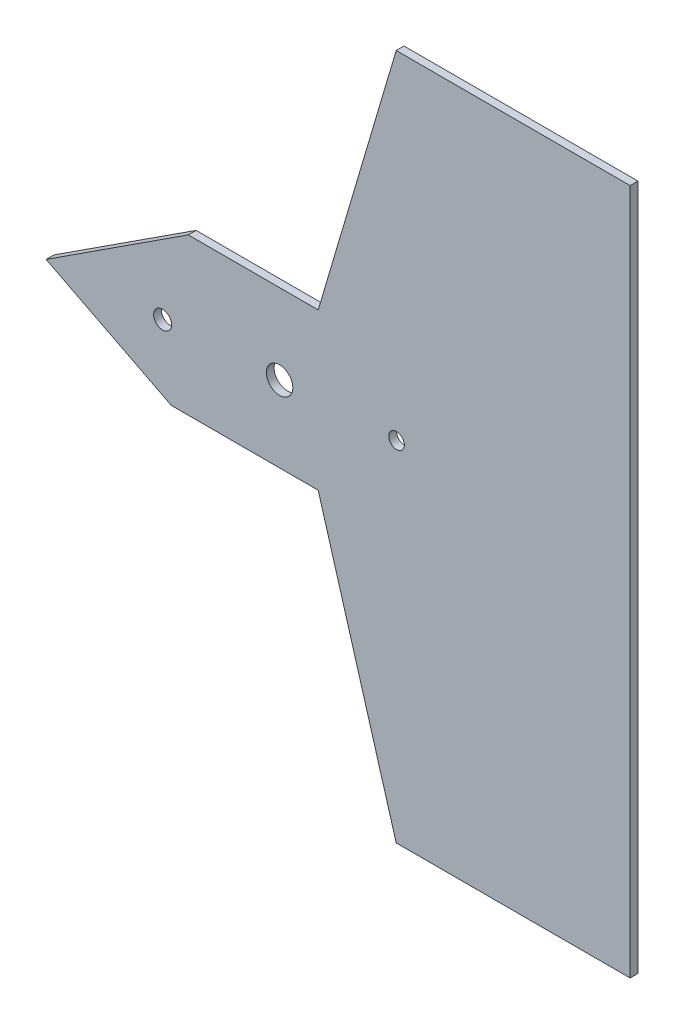
ISO-10303-21;
HEADER;
FILE_DESCRIPTION(('STEP AP214'),'2;1');
FILE_NAME('part.step','',(''),(''),'','','');
FILE_SCHEMA(('AUTOMOTIVE_DESIGN { 1 0 10303 214 1 1 1 1 }'));
ENDSEC;
DATA;
#1=APPLICATION_CONTEXT('core data for automotive mechanical design processes');
#2=APPLICATION_PROTOCOL_DEFINITION('international standard','automotive_design',2000,#1);
#3=PRODUCT_CONTEXT('',#1,'mechanical');
#4=PRODUCT('Part','Part','',(#3));
#5=PRODUCT_RELATED_PRODUCT_CATEGORY('part','',(#4));
#6=PRODUCT_DEFINITION_FORMATION('','',#4);
#7=PRODUCT_DEFINITION_CONTEXT('part definition',#1,'design');
#8=PRODUCT_DEFINITION('design','',#6,#7);
#9=PRODUCT_DEFINITION_SHAPE('','',#8);
#10=(LENGTH_UNIT() NAMED_UNIT(*) SI_UNIT(.MILLI.,.METRE.));
#11=(NAMED_UNIT(*) PLANE_ANGLE_UNIT() SI_UNIT($,.RADIAN.));
#12=(NAMED_UNIT(*) SI_UNIT($,.STERADIAN.) SOLID_ANGLE_UNIT());
#13=UNCERTAINTY_MEASURE_WITH_UNIT(LENGTH_MEASURE(1.E-05),#10,'distance_accuracy_value','');
#14=(GEOMETRIC_REPRESENTATION_CONTEXT(3) GLOBAL_UNCERTAINTY_ASSIGNED_CONTEXT((#13)) GLOBAL_UNIT_ASSIGNED_CONTEXT((#10,
#11,#12)) REPRESENTATION_CONTEXT('',''));
#15=CARTESIAN_POINT('',(0.,0.,0.));
#16=DIRECTION('',(0.,0.,1.));
#17=DIRECTION('',(1.,0.,0.));
#18=AXIS2_PLACEMENT_3D('',#15,#16,#17);
#19=CARTESIAN_POINT('',(141.039124357338,-8.97202755054697,311.2));
#20=DIRECTION('',(0.453981370177938,0.891011175873436,0.));
#21=DIRECTION('',(-0.891011175873436,0.453981370177938,0.));
#22=AXIS2_PLACEMENT_3D('',#19,#20,#21);
#23=PLANE('',#22);
#24=DIRECTION('',(0.891011175873435,-0.453981370177938,0.));
#25=VECTOR('',#24,1.);
#26=CARTESIAN_POINT('',(141.039124357338,-8.97202755054697,310.2));
#27=LINE('',#26,#25);
#28=CARTESIAN_POINT('',(124.975757597737,-0.787540701607435,310.2));
#29=VERTEX_POINT('',#28);
#30=CARTESIAN_POINT('',(141.039124357338,-8.97202755054697,310.2));
#31=VERTEX_POINT('',#30);
#32=EDGE_CURVE('E136',#29,#31,#27,.T.);
#33=ORIENTED_EDGE('',*,*,#32,.T.);
#34=DIRECTION('',(0.,0.,-1.));
#35=VECTOR('',#34,1.);
#36=CARTESIAN_POINT('',(141.039124357338,-8.97202755054697,311.2));
#37=LINE('',#36,#35);
#38=CARTESIAN_POINT('',(141.039124357338,-8.97202755054697,311.2));
#39=VERTEX_POINT('',#38);
#40=EDGE_CURVE('E11',#39,#31,#37,.T.);
#41=ORIENTED_EDGE('',*,*,#40,.F.);
#42=DIRECTION('',(0.891011175873435,-0.453981370177938,0.));
#43=VECTOR('',#42,1.);
#44=CARTESIAN_POINT('',(141.039124357338,-8.97202755054697,311.2));
#45=LINE('',#44,#43);
#46=CARTESIAN_POINT('',(124.975757597737,-0.787540701607435,311.2));
#47=VERTEX_POINT('',#46);
#48=EDGE_CURVE('E153',#47,#39,#45,.T.);
#49=ORIENTED_EDGE('',*,*,#48,.F.);
#50=DIRECTION('',(0.,0.,-1.));
#51=VECTOR('',#50,1.);
#52=CARTESIAN_POINT('',(124.975757597737,-0.787540701607435,311.2));
#53=LINE('',#52,#51);
#54=EDGE_CURVE('E132',#47,#29,#53,.T.);
#55=ORIENTED_EDGE('',*,*,#54,.T.);
#56=EDGE_LOOP('',(#33,#41,#49,#55));
#57=FACE_BOUND('',#56,.T.);
#58=ADVANCED_FACE('F34',(#57),#23,.F.);
#59=CARTESIAN_POINT('',(159.872932481578,-8.97202755054697,311.2));
#60=DIRECTION('',(0.,1.,0.));
#61=DIRECTION('',(-1.,0.,0.));
#62=AXIS2_PLACEMENT_3D('',#59,#60,#61);
#63=PLANE('',#62);
#64=DIRECTION('',(1.,0.,0.));
#65=VECTOR('',#64,1.);
#66=CARTESIAN_POINT('',(159.872932481578,-8.97202755054697,310.2));
#67=LINE('',#66,#65);
#68=CARTESIAN_POINT('',(159.872932481578,-8.97202755054697,310.2));
#69=VERTEX_POINT('',#68);
#70=EDGE_CURVE('E139',#31,#69,#67,.T.);
#71=ORIENTED_EDGE('',*,*,#70,.T.);
#72=DIRECTION('',(0.,0.,-1.));
#73=VECTOR('',#72,1.);
#74=CARTESIAN_POINT('',(159.872932481578,-8.97202755054697,311.2));
#75=LINE('',#74,#73);
#76=CARTESIAN_POINT('',(159.872932481578,-8.97202755054697,311.2));
#77=VERTEX_POINT('',#76);
#78=EDGE_CURVE('E42',#77,#69,#75,.T.);
#79=ORIENTED_EDGE('',*,*,#78,.F.);
#80=DIRECTION('',(1.,0.,0.));
#81=VECTOR('',#80,1.);
#82=CARTESIAN_POINT('',(159.872932481578,-8.97202755054697,311.2));
#83=LINE('',#82,#81);
#84=EDGE_CURVE('E96',#39,#77,#83,.T.);
#85=ORIENTED_EDGE('',*,*,#84,.F.);
#86=ORIENTED_EDGE('',*,*,#40,.T.);
#87=EDGE_LOOP('',(#71,#79,#85,#86));
#88=FACE_BOUND('',#87,.T.);
#89=ADVANCED_FACE('F239',(#88),#63,.F.);
#90=CARTESIAN_POINT('',(169.872932481578,-43.1379794844354,311.2));
#91=DIRECTION('',(0.959735822824036,0.280904165843568,0.));
#92=DIRECTION('',(-0.280904165843568,0.959735822824036,0.));
#93=AXIS2_PLACEMENT_3D('',#90,#91,#92);
#94=PLANE('',#93);
#95=DIRECTION('',(0.280904165843568,-0.959735822824036,0.));
#96=VECTOR('',#95,1.);
#97=CARTESIAN_POINT('',(169.872932481578,-43.1379794844354,310.2));
#98=LINE('',#97,#96);
#99=CARTESIAN_POINT('',(169.872932481578,-43.1379794844354,310.2));
#100=VERTEX_POINT('',#99);
#101=EDGE_CURVE('E142',#69,#100,#98,.T.);
#102=ORIENTED_EDGE('',*,*,#101,.T.);
#103=DIRECTION('',(0.,0.,-1.));
#104=VECTOR('',#103,1.);
#105=CARTESIAN_POINT('',(169.872932481578,-43.1379794844354,311.2));
#106=LINE('',#105,#104);
#107=CARTESIAN_POINT('',(169.872932481578,-43.1379794844354,311.2));
#108=VERTEX_POINT('',#107);
#109=EDGE_CURVE('E163',#108,#100,#106,.T.);
#110=ORIENTED_EDGE('',*,*,#109,.F.);
#111=DIRECTION('',(0.280904165843568,-0.959735822824036,0.));
#112=VECTOR('',#111,1.);
#113=CARTESIAN_POINT('',(169.872932481578,-43.1379794844354,311.2));
#114=LINE('',#113,#112);
#115=EDGE_CURVE('E171',#77,#108,#114,.T.);
#116=ORIENTED_EDGE('',*,*,#115,.F.);
#117=ORIENTED_EDGE('',*,*,#78,.T.);
#118=EDGE_LOOP('',(#102,#110,#116,#117));
#119=FACE_BOUND('',#118,.T.);
#120=ADVANCED_FACE('F169',(#119),#94,.F.);
#121=CARTESIAN_POINT('',(199.872932481578,-43.1379794844354,311.2));
#122=DIRECTION('',(0.,1.,0.));
#123=DIRECTION('',(-1.,0.,0.));
#124=AXIS2_PLACEMENT_3D('',#121,#122,#123);
#125=PLANE('',#124);
#126=DIRECTION('',(1.,0.,0.));
#127=VECTOR('',#126,1.);
#128=CARTESIAN_POINT('',(199.872932481578,-43.1379794844354,310.2));
#129=LINE('',#128,#127);
#130=CARTESIAN_POINT('',(199.872932481578,-43.1379794844354,310.2));
#131=VERTEX_POINT('',#130);
#132=EDGE_CURVE('E144',#100,#131,#129,.T.);
#133=ORIENTED_EDGE('',*,*,#132,.T.);
#134=DIRECTION('',(0.,0.,-1.));
#135=VECTOR('',#134,1.);
#136=CARTESIAN_POINT('',(199.872932481578,-43.1379794844354,311.2));
#137=LINE('',#136,#135);
#138=CARTESIAN_POINT('',(199.872932481578,-43.1379794844354,311.2));
#139=VERTEX_POINT('',#138);
#140=EDGE_CURVE('E160',#139,#131,#137,.T.);
#141=ORIENTED_EDGE('',*,*,#140,.F.);
#142=DIRECTION('',(1.,0.,0.));
#143=VECTOR('',#142,1.);
#144=CARTESIAN_POINT('',(199.872932481578,-43.1379794844354,311.2));
#145=LINE('',#144,#143);
#146=EDGE_CURVE('E187',#108,#139,#145,.T.);
#147=ORIENTED_EDGE('',*,*,#146,.F.);
#148=ORIENTED_EDGE('',*,*,#109,.T.);
#149=EDGE_LOOP('',(#133,#141,#147,#148));
#150=FACE_BOUND('',#149,.T.);
#151=ADVANCED_FACE('F180',(#150),#125,.F.);
#152=CARTESIAN_POINT('',(199.872932481578,44.8620205155646,311.2));
#153=DIRECTION('',(-1.,0.,0.));
#154=DIRECTION('',(0.,0.,1.));
#155=AXIS2_PLACEMENT_3D('',#152,#153,#154);
#156=PLANE('',#155);
#157=DIRECTION('',(0.,1.,0.));
#158=VECTOR('',#157,1.);
#159=CARTESIAN_POINT('',(199.872932481578,44.8620205155646,310.2));
#160=LINE('',#159,#158);
#161=CARTESIAN_POINT('',(199.872932481578,44.8620205155646,310.2));
#162=VERTEX_POINT('',#161);
#163=EDGE_CURVE('E146',#131,#162,#160,.T.);
#164=ORIENTED_EDGE('',*,*,#163,.T.);
#165=DIRECTION('',(0.,0.,-1.));
#166=VECTOR('',#165,1.);
#167=CARTESIAN_POINT('',(199.872932481578,44.8620205155646,311.2));
#168=LINE('',#167,#166);
#169=CARTESIAN_POINT('',(199.872932481578,44.8620205155646,311.2));
#170=VERTEX_POINT('',#169);
#171=EDGE_CURVE('E157',#170,#162,#168,.T.);
#172=ORIENTED_EDGE('',*,*,#171,.F.);
#173=DIRECTION('',(0.,1.,0.));
#174=VECTOR('',#173,1.);
#175=CARTESIAN_POINT('',(199.872932481578,44.8620205155646,311.2));
#176=LINE('',#175,#174);
#177=EDGE_CURVE('E186',#139,#170,#176,.T.);
#178=ORIENTED_EDGE('',*,*,#177,.F.);
#179=ORIENTED_EDGE('',*,*,#140,.T.);
#180=EDGE_LOOP('',(#164,#172,#178,#179));
#181=FACE_BOUND('',#180,.T.);
#182=ADVANCED_FACE('F184',(#181),#156,.F.);
#183=CARTESIAN_POINT('',(169.872932481578,44.8620205155646,311.2));
#184=DIRECTION('',(0.,-1.,0.));
#185=DIRECTION('',(0.,0.,-1.));
#186=AXIS2_PLACEMENT_3D('',#183,#184,#185);
#187=PLANE('',#186);
#188=DIRECTION('',(-1.,0.,0.));
#189=VECTOR('',#188,1.);
#190=CARTESIAN_POINT('',(169.872932481578,44.8620205155646,310.2));
#191=LINE('',#190,#189);
#192=CARTESIAN_POINT('',(169.872932481578,44.8620205155646,310.2));
#193=VERTEX_POINT('',#192);
#194=EDGE_CURVE('E148',#162,#193,#191,.T.);
#195=ORIENTED_EDGE('',*,*,#194,.T.);
#196=DIRECTION('',(0.,0.,-1.));
#197=VECTOR('',#196,1.);
#198=CARTESIAN_POINT('',(169.872932481578,44.8620205155646,311.2));
#199=LINE('',#198,#197);
#200=CARTESIAN_POINT('',(169.872932481578,44.8620205155646,311.2));
#201=VERTEX_POINT('',#200);
#202=EDGE_CURVE('E127',#201,#193,#199,.T.);
#203=ORIENTED_EDGE('',*,*,#202,.F.);
#204=DIRECTION('',(-1.,0.,0.));
#205=VECTOR('',#204,1.);
#206=CARTESIAN_POINT('',(169.872932481578,44.8620205155646,311.2));
#207=LINE('',#206,#205);
#208=EDGE_CURVE('E118',#170,#201,#207,.T.);
#209=ORIENTED_EDGE('',*,*,#208,.F.);
#210=ORIENTED_EDGE('',*,*,#171,.T.);
#211=EDGE_LOOP('',(#195,#203,#209,#210));
#212=FACE_BOUND('',#211,.T.);
#213=ADVANCED_FACE('F247',(#212),#187,.F.);
#214=CARTESIAN_POINT('',(159.872932481578,11.0554301249445,311.2));
#215=DIRECTION('',(0.958927561970118,-0.283651072435917,0.));
#216=DIRECTION('',(0.283651072435917,0.958927561970118,0.));
#217=AXIS2_PLACEMENT_3D('',#214,#215,#216);
#218=PLANE('',#217);
#219=DIRECTION('',(-0.283651072435917,-0.958927561970118,0.));
#220=VECTOR('',#219,1.);
#221=CARTESIAN_POINT('',(159.872932481578,11.0554301249445,310.2));
#222=LINE('',#221,#220);
#223=CARTESIAN_POINT('',(159.872932481578,11.0554301249445,310.2));
#224=VERTEX_POINT('',#223);
#225=EDGE_CURVE('E126',#193,#224,#222,.T.);
#226=ORIENTED_EDGE('',*,*,#225,.T.);
#227=DIRECTION('',(0.,0.,-1.));
#228=VECTOR('',#227,1.);
#229=CARTESIAN_POINT('',(159.872932481578,11.0554301249445,311.2));
#230=LINE('',#229,#228);
#231=CARTESIAN_POINT('',(159.872932481578,11.0554301249445,311.2));
#232=VERTEX_POINT('',#231);
#233=EDGE_CURVE('E123',#232,#224,#230,.T.);
#234=ORIENTED_EDGE('',*,*,#233,.F.);
#235=DIRECTION('',(-0.283651072435917,-0.958927561970118,0.));
#236=VECTOR('',#235,1.);
#237=CARTESIAN_POINT('',(159.872932481578,11.0554301249445,311.2));
#238=LINE('',#237,#236);
#239=EDGE_CURVE('E112',#201,#232,#238,.T.);
#240=ORIENTED_EDGE('',*,*,#239,.F.);
#241=ORIENTED_EDGE('',*,*,#202,.T.);
#242=EDGE_LOOP('',(#226,#234,#240,#241));
#243=FACE_BOUND('',#242,.T.);
#244=ADVANCED_FACE('F124',(#243),#218,.F.);
#245=CARTESIAN_POINT('',(143.21192436485,11.0554301249445,311.2));
#246=DIRECTION('',(0.,-1.,0.));
#247=DIRECTION('',(0.,0.,-1.));
#248=AXIS2_PLACEMENT_3D('',#245,#246,#247);
#249=PLANE('',#248);
#250=DIRECTION('',(-1.,0.,0.));
#251=VECTOR('',#250,1.);
#252=CARTESIAN_POINT('',(143.21192436485,11.0554301249445,310.2));
#253=LINE('',#252,#251);
#254=CARTESIAN_POINT('',(143.21192436485,11.0554301249445,310.2));
#255=VERTEX_POINT('',#254);
#256=EDGE_CURVE('E82',#224,#255,#253,.T.);
#257=ORIENTED_EDGE('',*,*,#256,.T.);
#258=DIRECTION('',(0.,0.,-1.));
#259=VECTOR('',#258,1.);
#260=CARTESIAN_POINT('',(143.21192436485,11.0554301249445,311.2));
#261=LINE('',#260,#259);
#262=CARTESIAN_POINT('',(143.21192436485,11.0554301249445,311.2));
#263=VERTEX_POINT('',#262);
#264=EDGE_CURVE('E128',#263,#255,#261,.T.);
#265=ORIENTED_EDGE('',*,*,#264,.F.);
#266=DIRECTION('',(-1.,0.,0.));
#267=VECTOR('',#266,1.);
#268=CARTESIAN_POINT('',(143.21192436485,11.0554301249445,311.2));
#269=LINE('',#268,#267);
#270=EDGE_CURVE('E116',#232,#263,#269,.T.);
#271=ORIENTED_EDGE('',*,*,#270,.F.);
#272=ORIENTED_EDGE('',*,*,#233,.T.);
#273=EDGE_LOOP('',(#257,#265,#271,#272));
#274=FACE_BOUND('',#273,.T.);
#275=ADVANCED_FACE('F130',(#274),#249,.F.);
#276=CARTESIAN_POINT('',(124.975757597737,-0.787540701607435,311.2));
#277=DIRECTION('',(0.544647628273267,-0.838664987355682,0.));
#278=DIRECTION('',(0.838664987355682,0.544647628273267,0.));
#279=AXIS2_PLACEMENT_3D('',#276,#277,#278);
#280=PLANE('',#279);
#281=DIRECTION('',(-0.838664987355682,-0.544647628273267,0.));
#282=VECTOR('',#281,1.);
#283=CARTESIAN_POINT('',(124.975757597737,-0.787540701607435,310.2));
#284=LINE('',#283,#282);
#285=EDGE_CURVE('E88',#255,#29,#284,.T.);
#286=ORIENTED_EDGE('',*,*,#285,.T.);
#287=ORIENTED_EDGE('',*,*,#54,.F.);
#288=DIRECTION('',(-0.838664987355682,-0.544647628273267,0.));
#289=VECTOR('',#288,1.);
#290=CARTESIAN_POINT('',(124.975757597737,-0.787540701607435,311.2));
#291=LINE('',#290,#289);
#292=EDGE_CURVE('E50',#263,#47,#291,.T.);
#293=ORIENTED_EDGE('',*,*,#292,.F.);
#294=ORIENTED_EDGE('',*,*,#264,.T.);
#295=EDGE_LOOP('',(#286,#287,#293,#294));
#296=FACE_BOUND('',#295,.T.);
#297=ADVANCED_FACE('F230',(#296),#280,.F.);
#298=CARTESIAN_POINT('',(0.,0.,311.2));
#299=DIRECTION('',(0.,0.,-1.));
#300=DIRECTION('',(-1.,0.,0.));
#301=AXIS2_PLACEMENT_3D('',#298,#299,#300);
#302=PLANE('',#301);
#303=CARTESIAN_POINT('',(139.917835466438,-0.00430606073981415,311.2));
#304=DIRECTION('',(0.,0.,-1.));
#305=DIRECTION('',(-1.,0.,0.));
#306=AXIS2_PLACEMENT_3D('',#303,#304,#305);
#307=CIRCLE('',#306,1.15000000000002);
#308=CARTESIAN_POINT('',(141.067835466438,-0.00430606073981415,311.2));
#309=VERTEX_POINT('',#308);
#310=EDGE_CURVE('E199',#309,#309,#307,.T.);
#311=ORIENTED_EDGE('',*,*,#310,.T.);
#312=EDGE_LOOP('',(#311));
#313=FACE_BOUND('',#312,.T.);
#314=CARTESIAN_POINT('',(154.917835466438,0.781810628505705,311.2));
#315=DIRECTION('',(0.,0.,-1.));
#316=DIRECTION('',(-1.,0.,0.));
#317=AXIS2_PLACEMENT_3D('',#314,#315,#316);
#318=CIRCLE('',#317,1.70000000000001);
#319=CARTESIAN_POINT('',(156.617835466438,0.781810628505705,311.2));
#320=VERTEX_POINT('',#319);
#321=EDGE_CURVE('E200',#320,#320,#318,.T.);
#322=ORIENTED_EDGE('',*,*,#321,.T.);
#323=EDGE_LOOP('',(#322));
#324=FACE_BOUND('',#323,.T.);
#325=CARTESIAN_POINT('',(169.917835466438,1.56792731775122,311.2));
#326=DIRECTION('',(0.,0.,-1.));
#327=DIRECTION('',(-1.,0.,0.));
#328=AXIS2_PLACEMENT_3D('',#325,#326,#327);
#329=CIRCLE('',#328,0.999999999999998);
#330=CARTESIAN_POINT('',(170.917835466438,1.56792731775122,311.2));
#331=VERTEX_POINT('',#330);
#332=EDGE_CURVE('E196',#331,#331,#329,.T.);
#333=ORIENTED_EDGE('',*,*,#332,.T.);
#334=EDGE_LOOP('',(#333));
#335=FACE_BOUND('',#334,.T.);
#336=ORIENTED_EDGE('',*,*,#48,.T.);
#337=ORIENTED_EDGE('',*,*,#84,.T.);
#338=ORIENTED_EDGE('',*,*,#115,.T.);
#339=ORIENTED_EDGE('',*,*,#146,.T.);
#340=ORIENTED_EDGE('',*,*,#177,.T.);
#341=ORIENTED_EDGE('',*,*,#208,.T.);
#342=ORIENTED_EDGE('',*,*,#239,.T.);
#343=ORIENTED_EDGE('',*,*,#270,.T.);
#344=ORIENTED_EDGE('',*,*,#292,.T.);
#345=EDGE_LOOP('',(#336,#337,#338,#339,#340,#341,#342,#343,#344));
#346=FACE_BOUND('',#345,.T.);
#347=ADVANCED_FACE('F114',(#313,#324,#335,#346),#302,.F.);
#348=CARTESIAN_POINT('',(0.,0.,310.2));
#349=DIRECTION('',(0.,0.,-1.));
#350=DIRECTION('',(-1.,0.,0.));
#351=AXIS2_PLACEMENT_3D('',#348,#349,#350);
#352=PLANE('',#351);
#353=CARTESIAN_POINT('',(139.917835466438,-0.00430606073981415,310.2));
#354=DIRECTION('',(0.,0.,-1.));
#355=DIRECTION('',(-1.,0.,0.));
#356=AXIS2_PLACEMENT_3D('',#353,#354,#355);
#357=CIRCLE('',#356,1.15000000000002);
#358=CARTESIAN_POINT('',(141.067835466438,-0.00430606073981415,310.2));
#359=VERTEX_POINT('',#358);
#360=EDGE_CURVE('E203',#359,#359,#357,.T.);
#361=ORIENTED_EDGE('',*,*,#360,.F.);
#362=EDGE_LOOP('',(#361));
#363=FACE_BOUND('',#362,.T.);
#364=CARTESIAN_POINT('',(154.917835466438,0.781810628505705,310.2));
#365=DIRECTION('',(0.,0.,-1.));
#366=DIRECTION('',(-1.,0.,0.));
#367=AXIS2_PLACEMENT_3D('',#364,#365,#366);
#368=CIRCLE('',#367,1.70000000000001);
#369=CARTESIAN_POINT('',(156.617835466438,0.781810628505705,310.2));
#370=VERTEX_POINT('',#369);
#371=EDGE_CURVE('E204',#370,#370,#368,.T.);
#372=ORIENTED_EDGE('',*,*,#371,.F.);
#373=EDGE_LOOP('',(#372));
#374=FACE_BOUND('',#373,.T.);
#375=CARTESIAN_POINT('',(169.917835466438,1.56792731775122,310.2));
#376=DIRECTION('',(0.,0.,-1.));
#377=DIRECTION('',(-1.,0.,0.));
#378=AXIS2_PLACEMENT_3D('',#375,#376,#377);
#379=CIRCLE('',#378,0.999999999999998);
#380=CARTESIAN_POINT('',(170.917835466438,1.56792731775122,310.2));
#381=VERTEX_POINT('',#380);
#382=EDGE_CURVE('E140',#381,#381,#379,.T.);
#383=ORIENTED_EDGE('',*,*,#382,.F.);
#384=EDGE_LOOP('',(#383));
#385=FACE_BOUND('',#384,.T.);
#386=ORIENTED_EDGE('',*,*,#32,.F.);
#387=ORIENTED_EDGE('',*,*,#285,.F.);
#388=ORIENTED_EDGE('',*,*,#256,.F.);
#389=ORIENTED_EDGE('',*,*,#225,.F.);
#390=ORIENTED_EDGE('',*,*,#194,.F.);
#391=ORIENTED_EDGE('',*,*,#163,.F.);
#392=ORIENTED_EDGE('',*,*,#132,.F.);
#393=ORIENTED_EDGE('',*,*,#101,.F.);
#394=ORIENTED_EDGE('',*,*,#70,.F.);
#395=EDGE_LOOP('',(#386,#387,#388,#389,#390,#391,#392,#393,#394));
#396=FACE_BOUND('',#395,.T.);
#397=ADVANCED_FACE('F175',(#363,#374,#385,#396),#352,.T.);
#398=CARTESIAN_POINT('',(169.917835466438,1.56792731775122,-14.001));
#399=DIRECTION('',(0.,0.,1.));
#400=DIRECTION('',(1.,0.,0.));
#401=AXIS2_PLACEMENT_3D('',#398,#399,#400);
#402=CYLINDRICAL_SURFACE('',#401,0.999999999999998);
#403=CARTESIAN_POINT('',(170.917835466438,1.56792731775122,310.2));
#404=CARTESIAN_POINT('',(170.917835466438,1.56792731775122,310.210416666667));
#405=CARTESIAN_POINT('',(170.917835466438,1.56792731775122,310.220833333333));
#406=CARTESIAN_POINT('',(170.917835466438,1.56792731775122,310.241666666667));
#407=CARTESIAN_POINT('',(170.917835466438,1.56792731775122,310.252083333333));
#408=CARTESIAN_POINT('',(170.917835466438,1.56792731775122,310.272916666667));
#409=CARTESIAN_POINT('',(170.917835466438,1.56792731775122,310.283333333333));
#410=CARTESIAN_POINT('',(170.917835466438,1.56792731775122,310.304166666667));
#411=CARTESIAN_POINT('',(170.917835466438,1.56792731775122,310.314583333333));
#412=CARTESIAN_POINT('',(170.917835466438,1.56792731775122,310.335416666667));
#413=CARTESIAN_POINT('',(170.917835466438,1.56792731775122,310.345833333333));
#414=CARTESIAN_POINT('',(170.917835466438,1.56792731775122,310.366666666667));
#415=CARTESIAN_POINT('',(170.917835466438,1.56792731775122,310.377083333333));
#416=CARTESIAN_POINT('',(170.917835466438,1.56792731775122,310.397916666667));
#417=CARTESIAN_POINT('',(170.917835466438,1.56792731775122,310.408333333333));
#418=CARTESIAN_POINT('',(170.917835466438,1.56792731775122,310.429166666667));
#419=CARTESIAN_POINT('',(170.917835466438,1.56792731775122,310.439583333333));
#420=CARTESIAN_POINT('',(170.917835466438,1.56792731775122,310.460416666667));
#421=CARTESIAN_POINT('',(170.917835466438,1.56792731775122,310.470833333333));
#422=CARTESIAN_POINT('',(170.917835466438,1.56792731775122,310.491666666667));
#423=CARTESIAN_POINT('',(170.917835466438,1.56792731775122,310.502083333333));
#424=CARTESIAN_POINT('',(170.917835466438,1.56792731775122,310.522916666667));
#425=CARTESIAN_POINT('',(170.917835466438,1.56792731775122,310.533333333333));
#426=CARTESIAN_POINT('',(170.917835466438,1.56792731775122,310.554166666667));
#427=CARTESIAN_POINT('',(170.917835466438,1.56792731775122,310.564583333333));
#428=CARTESIAN_POINT('',(170.917835466438,1.56792731775122,310.585416666667));
#429=CARTESIAN_POINT('',(170.917835466438,1.56792731775122,310.595833333333));
#430=CARTESIAN_POINT('',(170.917835466438,1.56792731775122,310.616666666667));
#431=CARTESIAN_POINT('',(170.917835466438,1.56792731775122,310.627083333333));
#432=CARTESIAN_POINT('',(170.917835466438,1.56792731775122,310.647916666667));
#433=CARTESIAN_POINT('',(170.917835466438,1.56792731775122,310.658333333333));
#434=CARTESIAN_POINT('',(170.917835466438,1.56792731775122,310.679166666667));
#435=CARTESIAN_POINT('',(170.917835466438,1.56792731775122,310.689583333333));
#436=CARTESIAN_POINT('',(170.917835466438,1.56792731775122,310.710416666667));
#437=CARTESIAN_POINT('',(170.917835466438,1.56792731775122,310.720833333333));
#438=CARTESIAN_POINT('',(170.917835466438,1.56792731775122,310.741666666667));
#439=CARTESIAN_POINT('',(170.917835466438,1.56792731775122,310.752083333333));
#440=CARTESIAN_POINT('',(170.917835466438,1.56792731775122,310.772916666667));
#441=CARTESIAN_POINT('',(170.917835466438,1.56792731775122,310.783333333333));
#442=CARTESIAN_POINT('',(170.917835466438,1.56792731775122,310.804166666667));
#443=CARTESIAN_POINT('',(170.917835466438,1.56792731775122,310.814583333333));
#444=CARTESIAN_POINT('',(170.917835466438,1.56792731775122,310.835416666667));
#445=CARTESIAN_POINT('',(170.917835466438,1.56792731775122,310.845833333333));
#446=CARTESIAN_POINT('',(170.917835466438,1.56792731775122,310.866666666667));
#447=CARTESIAN_POINT('',(170.917835466438,1.56792731775122,310.877083333333));
#448=CARTESIAN_POINT('',(170.917835466438,1.56792731775122,310.897916666667));
#449=CARTESIAN_POINT('',(170.917835466438,1.56792731775122,310.908333333333));
#450=CARTESIAN_POINT('',(170.917835466438,1.56792731775122,310.929166666667));
#451=CARTESIAN_POINT('',(170.917835466438,1.56792731775122,310.939583333333));
#452=CARTESIAN_POINT('',(170.917835466438,1.56792731775122,310.960416666667));
#453=CARTESIAN_POINT('',(170.917835466438,1.56792731775122,310.970833333333));
#454=CARTESIAN_POINT('',(170.917835466438,1.56792731775122,310.991666666667));
#455=CARTESIAN_POINT('',(170.917835466438,1.56792731775122,311.002083333333));
#456=CARTESIAN_POINT('',(170.917835466438,1.56792731775122,311.022916666667));
#457=CARTESIAN_POINT('',(170.917835466438,1.56792731775122,311.033333333333));
#458=CARTESIAN_POINT('',(170.917835466438,1.56792731775122,311.054166666667));
#459=CARTESIAN_POINT('',(170.917835466438,1.56792731775122,311.064583333333));
#460=CARTESIAN_POINT('',(170.917835466438,1.56792731775122,311.085416666667));
#461=CARTESIAN_POINT('',(170.917835466438,1.56792731775122,311.095833333333));
#462=CARTESIAN_POINT('',(170.917835466438,1.56792731775122,311.116666666667));
#463=CARTESIAN_POINT('',(170.917835466438,1.56792731775122,311.127083333333));
#464=CARTESIAN_POINT('',(170.917835466438,1.56792731775122,311.147916666667));
#465=CARTESIAN_POINT('',(170.917835466438,1.56792731775122,311.158333333333));
#466=CARTESIAN_POINT('',(170.917835466438,1.56792731775122,311.179166666667));
#467=CARTESIAN_POINT('',(170.917835466438,1.56792731775122,311.189583333333));
#468=CARTESIAN_POINT('',(170.917835466438,1.56792731775122,311.2));
#469=B_SPLINE_CURVE_WITH_KNOTS('',3,(#403,#404,#405,#406,#407,#408,#409,#410,#411,#412,#413,
#414,#415,#416,#417,#418,#419,#420,#421,#422,#423,#424,#425,#426,#427,#428,#429,#430,#431,#432,
#433,#434,#435,#436,#437,#438,#439,#440,#441,#442,#443,#444,#445,#446,#447,#448,#449,#450,#451,
#452,#453,#454,#455,#456,#457,#458,#459,#460,#461,#462,#463,#464,#465,#466,#467,#468),
.UNSPECIFIED.,.F.,.F.,(4,2,2,2,2,2,2,2,2,2,2,2,2,2,2,2,2,2,2,2,2,2,2,2,2,2,2,2,2,2,2,2,4),(0.,
0.0312499999999827,0.0625000000000209,0.0937500000000036,0.124999999999986,0.156250000000024,
0.187500000000007,0.21874999999999,0.249999999999972,0.281250000000011,0.312499999999993,
0.343749999999976,0.375000000000014,0.406249999999997,0.43749999999998,0.468750000000018,0.5,
0.531249999999983,0.562500000000021,0.593750000000004,0.624999999999987,0.656250000000025,
0.687500000000008,0.71874999999999,0.750000000000028,0.781250000000011,0.812499999999994,
0.843749999999976,0.875000000000015,0.906249999999997,0.93749999999998,0.968750000000018,1.),.UNSPECIFIED.);
#470=EDGE_CURVE('BSEAM217',#381,#331,#469,.T.);
#471=ORIENTED_EDGE('',*,*,#382,.T.);
#472=ORIENTED_EDGE('',*,*,#332,.F.);
#473=ORIENTED_EDGE('',*,*,#470,.T.);
#474=ORIENTED_EDGE('',*,*,#470,.F.);
#475=EDGE_LOOP('',(#471,#473,#472,#474));
#476=FACE_BOUND('',#475,.T.);
#477=ADVANCED_FACE('F217',(#476),#402,.F.);
#478=CARTESIAN_POINT('',(154.917835466438,0.781810628505705,-14.001));
#479=DIRECTION('',(0.,0.,1.));
#480=DIRECTION('',(1.,0.,0.));
#481=AXIS2_PLACEMENT_3D('',#478,#479,#480);
#482=CYLINDRICAL_SURFACE('',#481,1.70000000000001);
#483=CARTESIAN_POINT('',(156.617835466438,0.781810628505705,310.2));
#484=CARTESIAN_POINT('',(156.617835466438,0.781810628505705,310.210416666667));
#485=CARTESIAN_POINT('',(156.617835466438,0.781810628505705,310.220833333333));
#486=CARTESIAN_POINT('',(156.617835466438,0.781810628505705,310.241666666667));
#487=CARTESIAN_POINT('',(156.617835466438,0.781810628505705,310.252083333333));
#488=CARTESIAN_POINT('',(156.617835466438,0.781810628505705,310.272916666667));
#489=CARTESIAN_POINT('',(156.617835466438,0.781810628505705,310.283333333333));
#490=CARTESIAN_POINT('',(156.617835466438,0.781810628505705,310.304166666667));
#491=CARTESIAN_POINT('',(156.617835466438,0.781810628505705,310.314583333333));
#492=CARTESIAN_POINT('',(156.617835466438,0.781810628505705,310.335416666667));
#493=CARTESIAN_POINT('',(156.617835466438,0.781810628505705,310.345833333333));
#494=CARTESIAN_POINT('',(156.617835466438,0.781810628505705,310.366666666667));
#495=CARTESIAN_POINT('',(156.617835466438,0.781810628505705,310.377083333333));
#496=CARTESIAN_POINT('',(156.617835466438,0.781810628505705,310.397916666667));
#497=CARTESIAN_POINT('',(156.617835466438,0.781810628505705,310.408333333333));
#498=CARTESIAN_POINT('',(156.617835466438,0.781810628505705,310.429166666667));
#499=CARTESIAN_POINT('',(156.617835466438,0.781810628505705,310.439583333333));
#500=CARTESIAN_POINT('',(156.617835466438,0.781810628505705,310.460416666667));
#501=CARTESIAN_POINT('',(156.617835466438,0.781810628505705,310.470833333333));
#502=CARTESIAN_POINT('',(156.617835466438,0.781810628505705,310.491666666667));
#503=CARTESIAN_POINT('',(156.617835466438,0.781810628505705,310.502083333333));
#504=CARTESIAN_POINT('',(156.617835466438,0.781810628505705,310.522916666667));
#505=CARTESIAN_POINT('',(156.617835466438,0.781810628505705,310.533333333333));
#506=CARTESIAN_POINT('',(156.617835466438,0.781810628505705,310.554166666667));
#507=CARTESIAN_POINT('',(156.617835466438,0.781810628505705,310.564583333333));
#508=CARTESIAN_POINT('',(156.617835466438,0.781810628505705,310.585416666667));
#509=CARTESIAN_POINT('',(156.617835466438,0.781810628505705,310.595833333333));
#510=CARTESIAN_POINT('',(156.617835466438,0.781810628505705,310.616666666667));
#511=CARTESIAN_POINT('',(156.617835466438,0.781810628505705,310.627083333333));
#512=CARTESIAN_POINT('',(156.617835466438,0.781810628505705,310.647916666667));
#513=CARTESIAN_POINT('',(156.617835466438,0.781810628505705,310.658333333333));
#514=CARTESIAN_POINT('',(156.617835466438,0.781810628505705,310.679166666667));
#515=CARTESIAN_POINT('',(156.617835466438,0.781810628505705,310.689583333333));
#516=CARTESIAN_POINT('',(156.617835466438,0.781810628505705,310.710416666667));
#517=CARTESIAN_POINT('',(156.617835466438,0.781810628505705,310.720833333333));
#518=CARTESIAN_POINT('',(156.617835466438,0.781810628505705,310.741666666667));
#519=CARTESIAN_POINT('',(156.617835466438,0.781810628505705,310.752083333333));
#520=CARTESIAN_POINT('',(156.617835466438,0.781810628505705,310.772916666667));
#521=CARTESIAN_POINT('',(156.617835466438,0.781810628505705,310.783333333333));
#522=CARTESIAN_POINT('',(156.617835466438,0.781810628505705,310.804166666667));
#523=CARTESIAN_POINT('',(156.617835466438,0.781810628505705,310.814583333333));
#524=CARTESIAN_POINT('',(156.617835466438,0.781810628505705,310.835416666667));
#525=CARTESIAN_POINT('',(156.617835466438,0.781810628505705,310.845833333333));
#526=CARTESIAN_POINT('',(156.617835466438,0.781810628505705,310.866666666667));
#527=CARTESIAN_POINT('',(156.617835466438,0.781810628505705,310.877083333333));
#528=CARTESIAN_POINT('',(156.617835466438,0.781810628505705,310.897916666667));
#529=CARTESIAN_POINT('',(156.617835466438,0.781810628505705,310.908333333333));
#530=CARTESIAN_POINT('',(156.617835466438,0.781810628505705,310.929166666667));
#531=CARTESIAN_POINT('',(156.617835466438,0.781810628505705,310.939583333333));
#532=CARTESIAN_POINT('',(156.617835466438,0.781810628505705,310.960416666667));
#533=CARTESIAN_POINT('',(156.617835466438,0.781810628505705,310.970833333333));
#534=CARTESIAN_POINT('',(156.617835466438,0.781810628505705,310.991666666667));
#535=CARTESIAN_POINT('',(156.617835466438,0.781810628505705,311.002083333333));
#536=CARTESIAN_POINT('',(156.617835466438,0.781810628505705,311.022916666667));
#537=CARTESIAN_POINT('',(156.617835466438,0.781810628505705,311.033333333333));
#538=CARTESIAN_POINT('',(156.617835466438,0.781810628505705,311.054166666667));
#539=CARTESIAN_POINT('',(156.617835466438,0.781810628505705,311.064583333333));
#540=CARTESIAN_POINT('',(156.617835466438,0.781810628505705,311.085416666667));
#541=CARTESIAN_POINT('',(156.617835466438,0.781810628505705,311.095833333333));
#542=CARTESIAN_POINT('',(156.617835466438,0.781810628505705,311.116666666667));
#543=CARTESIAN_POINT('',(156.617835466438,0.781810628505705,311.127083333333));
#544=CARTESIAN_POINT('',(156.617835466438,0.781810628505705,311.147916666667));
#545=CARTESIAN_POINT('',(156.617835466438,0.781810628505705,311.158333333333));
#546=CARTESIAN_POINT('',(156.617835466438,0.781810628505705,311.179166666667));
#547=CARTESIAN_POINT('',(156.617835466438,0.781810628505705,311.189583333333));
#548=CARTESIAN_POINT('',(156.617835466438,0.781810628505705,311.2));
#549=B_SPLINE_CURVE_WITH_KNOTS('',3,(#483,#484,#485,#486,#487,#488,#489,#490,#491,#492,#493,
#494,#495,#496,#497,#498,#499,#500,#501,#502,#503,#504,#505,#506,#507,#508,#509,#510,#511,#512,
#513,#514,#515,#516,#517,#518,#519,#520,#521,#522,#523,#524,#525,#526,#527,#528,#529,#530,#531,
#532,#533,#534,#535,#536,#537,#538,#539,#540,#541,#542,#543,#544,#545,#546,#547,#548),
.UNSPECIFIED.,.F.,.F.,(4,2,2,2,2,2,2,2,2,2,2,2,2,2,2,2,2,2,2,2,2,2,2,2,2,2,2,2,2,2,2,2,4),(0.,
0.0312499999999827,0.0625000000000209,0.0937500000000036,0.124999999999986,0.156250000000024,
0.187500000000007,0.21874999999999,0.249999999999972,0.281250000000011,0.312499999999993,
0.343749999999976,0.375000000000014,0.406249999999997,0.43749999999998,0.468750000000018,0.5,
0.531249999999983,0.562500000000021,0.593750000000004,0.624999999999987,0.656250000000025,
0.687500000000008,0.71874999999999,0.750000000000028,0.781250000000011,0.812499999999994,
0.843749999999976,0.875000000000015,0.906249999999997,0.93749999999998,0.968750000000018,1.),.UNSPECIFIED.);
#550=EDGE_CURVE('BSEAM225',#370,#320,#549,.T.);
#551=ORIENTED_EDGE('',*,*,#371,.T.);
#552=ORIENTED_EDGE('',*,*,#321,.F.);
#553=ORIENTED_EDGE('',*,*,#550,.T.);
#554=ORIENTED_EDGE('',*,*,#550,.F.);
#555=EDGE_LOOP('',(#551,#553,#552,#554));
#556=FACE_BOUND('',#555,.T.);
#557=ADVANCED_FACE('F225',(#556),#482,.F.);
#558=CARTESIAN_POINT('',(139.917835466438,-0.00430606073981415,-14.001));
#559=DIRECTION('',(0.,0.,1.));
#560=DIRECTION('',(1.,0.,0.));
#561=AXIS2_PLACEMENT_3D('',#558,#559,#560);
#562=CYLINDRICAL_SURFACE('',#561,1.15000000000002);
#563=CARTESIAN_POINT('',(141.067835466438,-0.00430606073981415,310.2));
#564=CARTESIAN_POINT('',(141.067835466438,-0.00430606073981415,310.210416666667));
#565=CARTESIAN_POINT('',(141.067835466438,-0.00430606073981415,310.220833333333));
#566=CARTESIAN_POINT('',(141.067835466438,-0.00430606073981415,310.241666666667));
#567=CARTESIAN_POINT('',(141.067835466438,-0.00430606073981415,310.252083333333));
#568=CARTESIAN_POINT('',(141.067835466438,-0.00430606073981415,310.272916666667));
#569=CARTESIAN_POINT('',(141.067835466438,-0.00430606073981415,310.283333333333));
#570=CARTESIAN_POINT('',(141.067835466438,-0.00430606073981415,310.304166666667));
#571=CARTESIAN_POINT('',(141.067835466438,-0.00430606073981415,310.314583333333));
#572=CARTESIAN_POINT('',(141.067835466438,-0.00430606073981415,310.335416666667));
#573=CARTESIAN_POINT('',(141.067835466438,-0.00430606073981415,310.345833333333));
#574=CARTESIAN_POINT('',(141.067835466438,-0.00430606073981415,310.366666666667));
#575=CARTESIAN_POINT('',(141.067835466438,-0.00430606073981415,310.377083333333));
#576=CARTESIAN_POINT('',(141.067835466438,-0.00430606073981415,310.397916666667));
#577=CARTESIAN_POINT('',(141.067835466438,-0.00430606073981415,310.408333333333));
#578=CARTESIAN_POINT('',(141.067835466438,-0.00430606073981415,310.429166666667));
#579=CARTESIAN_POINT('',(141.067835466438,-0.00430606073981415,310.439583333333));
#580=CARTESIAN_POINT('',(141.067835466438,-0.00430606073981415,310.460416666667));
#581=CARTESIAN_POINT('',(141.067835466438,-0.00430606073981415,310.470833333333));
#582=CARTESIAN_POINT('',(141.067835466438,-0.00430606073981415,310.491666666667));
#583=CARTESIAN_POINT('',(141.067835466438,-0.00430606073981415,310.502083333333));
#584=CARTESIAN_POINT('',(141.067835466438,-0.00430606073981415,310.522916666667));
#585=CARTESIAN_POINT('',(141.067835466438,-0.00430606073981415,310.533333333333));
#586=CARTESIAN_POINT('',(141.067835466438,-0.00430606073981415,310.554166666667));
#587=CARTESIAN_POINT('',(141.067835466438,-0.00430606073981415,310.564583333333));
#588=CARTESIAN_POINT('',(141.067835466438,-0.00430606073981415,310.585416666667));
#589=CARTESIAN_POINT('',(141.067835466438,-0.00430606073981415,310.595833333333));
#590=CARTESIAN_POINT('',(141.067835466438,-0.00430606073981415,310.616666666667));
#591=CARTESIAN_POINT('',(141.067835466438,-0.00430606073981415,310.627083333333));
#592=CARTESIAN_POINT('',(141.067835466438,-0.00430606073981415,310.647916666667));
#593=CARTESIAN_POINT('',(141.067835466438,-0.00430606073981415,310.658333333333));
#594=CARTESIAN_POINT('',(141.067835466438,-0.00430606073981415,310.679166666667));
#595=CARTESIAN_POINT('',(141.067835466438,-0.00430606073981415,310.689583333333));
#596=CARTESIAN_POINT('',(141.067835466438,-0.00430606073981415,310.710416666667));
#597=CARTESIAN_POINT('',(141.067835466438,-0.00430606073981415,310.720833333333));
#598=CARTESIAN_POINT('',(141.067835466438,-0.00430606073981415,310.741666666667));
#599=CARTESIAN_POINT('',(141.067835466438,-0.00430606073981415,310.752083333333));
#600=CARTESIAN_POINT('',(141.067835466438,-0.00430606073981415,310.772916666667));
#601=CARTESIAN_POINT('',(141.067835466438,-0.00430606073981415,310.783333333333));
#602=CARTESIAN_POINT('',(141.067835466438,-0.00430606073981415,310.804166666667));
#603=CARTESIAN_POINT('',(141.067835466438,-0.00430606073981415,310.814583333333));
#604=CARTESIAN_POINT('',(141.067835466438,-0.00430606073981415,310.835416666667));
#605=CARTESIAN_POINT('',(141.067835466438,-0.00430606073981415,310.845833333333));
#606=CARTESIAN_POINT('',(141.067835466438,-0.00430606073981415,310.866666666667));
#607=CARTESIAN_POINT('',(141.067835466438,-0.00430606073981415,310.877083333333));
#608=CARTESIAN_POINT('',(141.067835466438,-0.00430606073981415,310.897916666667));
#609=CARTESIAN_POINT('',(141.067835466438,-0.00430606073981415,310.908333333333));
#610=CARTESIAN_POINT('',(141.067835466438,-0.00430606073981415,310.929166666667));
#611=CARTESIAN_POINT('',(141.067835466438,-0.00430606073981415,310.939583333333));
#612=CARTESIAN_POINT('',(141.067835466438,-0.00430606073981415,310.960416666667));
#613=CARTESIAN_POINT('',(141.067835466438,-0.00430606073981415,310.970833333333));
#614=CARTESIAN_POINT('',(141.067835466438,-0.00430606073981415,310.991666666667));
#615=CARTESIAN_POINT('',(141.067835466438,-0.00430606073981415,311.002083333333));
#616=CARTESIAN_POINT('',(141.067835466438,-0.00430606073981415,311.022916666667));
#617=CARTESIAN_POINT('',(141.067835466438,-0.00430606073981415,311.033333333333));
#618=CARTESIAN_POINT('',(141.067835466438,-0.00430606073981415,311.054166666667));
#619=CARTESIAN_POINT('',(141.067835466438,-0.00430606073981415,311.064583333333));
#620=CARTESIAN_POINT('',(141.067835466438,-0.00430606073981415,311.085416666667));
#621=CARTESIAN_POINT('',(141.067835466438,-0.00430606073981415,311.095833333333));
#622=CARTESIAN_POINT('',(141.067835466438,-0.00430606073981415,311.116666666667));
#623=CARTESIAN_POINT('',(141.067835466438,-0.00430606073981415,311.127083333333));
#624=CARTESIAN_POINT('',(141.067835466438,-0.00430606073981415,311.147916666667));
#625=CARTESIAN_POINT('',(141.067835466438,-0.00430606073981415,311.158333333333));
#626=CARTESIAN_POINT('',(141.067835466438,-0.00430606073981415,311.179166666667));
#627=CARTESIAN_POINT('',(141.067835466438,-0.00430606073981415,311.189583333333));
#628=CARTESIAN_POINT('',(141.067835466438,-0.00430606073981415,311.2));
#629=B_SPLINE_CURVE_WITH_KNOTS('',3,(#563,#564,#565,#566,#567,#568,#569,#570,#571,#572,#573,
#574,#575,#576,#577,#578,#579,#580,#581,#582,#583,#584,#585,#586,#587,#588,#589,#590,#591,#592,
#593,#594,#595,#596,#597,#598,#599,#600,#601,#602,#603,#604,#605,#606,#607,#608,#609,#610,#611,
#612,#613,#614,#615,#616,#617,#618,#619,#620,#621,#622,#623,#624,#625,#626,#627,#628),
.UNSPECIFIED.,.F.,.F.,(4,2,2,2,2,2,2,2,2,2,2,2,2,2,2,2,2,2,2,2,2,2,2,2,2,2,2,2,2,2,2,2,4),(0.,
0.0312499999999827,0.0625000000000209,0.0937500000000036,0.124999999999986,0.156250000000024,
0.187500000000007,0.21874999999999,0.249999999999972,0.281250000000011,0.312499999999993,
0.343749999999976,0.375000000000014,0.406249999999997,0.43749999999998,0.468750000000018,0.5,
0.531249999999983,0.562500000000021,0.593750000000004,0.624999999999987,0.656250000000025,
0.687500000000008,0.71874999999999,0.750000000000028,0.781250000000011,0.812499999999994,
0.843749999999976,0.875000000000015,0.906249999999997,0.93749999999998,0.968750000000018,1.),.UNSPECIFIED.);
#630=EDGE_CURVE('BSEAM212',#359,#309,#629,.T.);
#631=ORIENTED_EDGE('',*,*,#360,.T.);
#632=ORIENTED_EDGE('',*,*,#310,.F.);
#633=ORIENTED_EDGE('',*,*,#630,.T.);
#634=ORIENTED_EDGE('',*,*,#630,.F.);
#635=EDGE_LOOP('',(#631,#633,#632,#634));
#636=FACE_BOUND('',#635,.T.);
#637=ADVANCED_FACE('F212',(#636),#562,.F.);
#638=CLOSED_SHELL('',(#58,#89,#120,#151,#182,#213,#244,#275,#297,#347,#397,#477,#557,#637));
#639=MANIFOLD_SOLID_BREP('B2',#638);
#640=ADVANCED_BREP_SHAPE_REPRESENTATION('',(#18,#639),#14);
#641=SHAPE_DEFINITION_REPRESENTATION(#9,#640);
ENDSEC;
END-ISO-10303-21;
